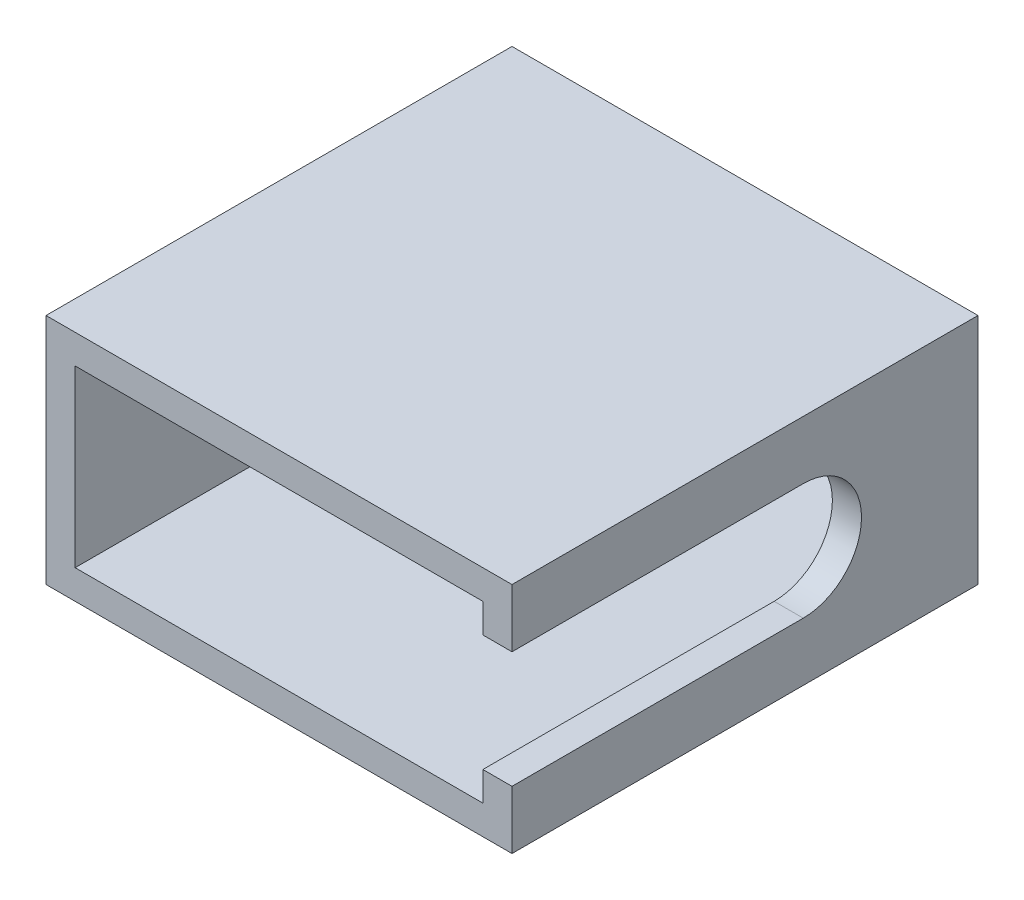
ISO-10303-21;
HEADER;
FILE_DESCRIPTION(('STEP AP214'),'2;1');
FILE_NAME('part.step','',(''),(''),'','','');
FILE_SCHEMA(('AUTOMOTIVE_DESIGN { 1 0 10303 214 1 1 1 1 }'));
ENDSEC;
DATA;
#1=APPLICATION_CONTEXT('core data for automotive mechanical design processes');
#2=APPLICATION_PROTOCOL_DEFINITION('international standard','automotive_design',2000,#1);
#3=PRODUCT_CONTEXT('',#1,'mechanical');
#4=PRODUCT('Part','Part','',(#3));
#5=PRODUCT_RELATED_PRODUCT_CATEGORY('part','',(#4));
#6=PRODUCT_DEFINITION_FORMATION('','',#4);
#7=PRODUCT_DEFINITION_CONTEXT('part definition',#1,'design');
#8=PRODUCT_DEFINITION('design','',#6,#7);
#9=PRODUCT_DEFINITION_SHAPE('','',#8);
#10=(LENGTH_UNIT() NAMED_UNIT(*) SI_UNIT(.MILLI.,.METRE.));
#11=(NAMED_UNIT(*) PLANE_ANGLE_UNIT() SI_UNIT($,.RADIAN.));
#12=(NAMED_UNIT(*) SI_UNIT($,.STERADIAN.) SOLID_ANGLE_UNIT());
#13=UNCERTAINTY_MEASURE_WITH_UNIT(LENGTH_MEASURE(1.E-05),#10,'distance_accuracy_value','');
#14=(GEOMETRIC_REPRESENTATION_CONTEXT(3) GLOBAL_UNCERTAINTY_ASSIGNED_CONTEXT((#13)) GLOBAL_UNIT_ASSIGNED_CONTEXT((#10,
#11,#12)) REPRESENTATION_CONTEXT('',''));
#15=CARTESIAN_POINT('',(0.,0.,0.));
#16=DIRECTION('',(0.,0.,1.));
#17=DIRECTION('',(1.,0.,0.));
#18=AXIS2_PLACEMENT_3D('',#15,#16,#17);
#19=CARTESIAN_POINT('',(25.4,12.7,50.8));
#20=DIRECTION('',(-1.,0.,0.));
#21=DIRECTION('',(0.,-1.,0.));
#22=AXIS2_PLACEMENT_3D('',#19,#20,#21);
#23=PLANE('',#22);
#24=DIRECTION('',(0.,1.,0.));
#25=VECTOR('',#24,1.);
#26=CARTESIAN_POINT('',(25.4,12.7,50.8));
#27=LINE('',#26,#25);
#28=CARTESIAN_POINT('',(25.4,6.35,50.8));
#29=VERTEX_POINT('',#28);
#30=CARTESIAN_POINT('',(25.4,12.7,50.8));
#31=VERTEX_POINT('',#30);
#32=EDGE_CURVE('E121',#29,#31,#27,.T.);
#33=ORIENTED_EDGE('',*,*,#32,.F.);
#34=DIRECTION('',(0.,0.,1.));
#35=VECTOR('',#34,1.);
#36=CARTESIAN_POINT('',(25.4,6.35,50.8));
#37=LINE('',#36,#35);
#38=CARTESIAN_POINT('',(25.4,6.35,19.05));
#39=VERTEX_POINT('',#38);
#40=EDGE_CURVE('E104',#39,#29,#37,.T.);
#41=ORIENTED_EDGE('',*,*,#40,.F.);
#42=CARTESIAN_POINT('',(25.4,0.,19.05));
#43=DIRECTION('',(1.,0.,0.));
#44=DIRECTION('',(0.,1.,0.));
#45=AXIS2_PLACEMENT_3D('',#42,#43,#44);
#46=CIRCLE('',#45,6.35);
#47=CARTESIAN_POINT('',(25.4,-6.35,19.05));
#48=VERTEX_POINT('',#47);
#49=EDGE_CURVE('E116',#48,#39,#46,.T.);
#50=ORIENTED_EDGE('',*,*,#49,.F.);
#51=DIRECTION('',(0.,0.,-1.));
#52=VECTOR('',#51,1.);
#53=CARTESIAN_POINT('',(25.4,-6.35,50.8));
#54=LINE('',#53,#52);
#55=CARTESIAN_POINT('',(25.4,-6.35,50.8));
#56=VERTEX_POINT('',#55);
#57=EDGE_CURVE('E175',#56,#48,#54,.T.);
#58=ORIENTED_EDGE('',*,*,#57,.F.);
#59=CARTESIAN_POINT('',(25.4,-12.7,50.8));
#60=VERTEX_POINT('',#59);
#61=EDGE_CURVE('E130',#60,#56,#27,.T.);
#62=ORIENTED_EDGE('',*,*,#61,.F.);
#63=DIRECTION('',(0.,0.,-1.));
#64=VECTOR('',#63,1.);
#65=CARTESIAN_POINT('',(25.4,-12.7,50.8));
#66=LINE('',#65,#64);
#67=CARTESIAN_POINT('',(25.4,-12.7,0.));
#68=VERTEX_POINT('',#67);
#69=EDGE_CURVE('E146',#60,#68,#66,.T.);
#70=ORIENTED_EDGE('',*,*,#69,.T.);
#71=DIRECTION('',(0.,1.,0.));
#72=VECTOR('',#71,1.);
#73=CARTESIAN_POINT('',(25.4,12.7,0.));
#74=LINE('',#73,#72);
#75=CARTESIAN_POINT('',(25.4,12.7,0.));
#76=VERTEX_POINT('',#75);
#77=EDGE_CURVE('E147',#68,#76,#74,.T.);
#78=ORIENTED_EDGE('',*,*,#77,.T.);
#79=DIRECTION('',(0.,0.,-1.));
#80=VECTOR('',#79,1.);
#81=CARTESIAN_POINT('',(25.4,12.7,50.8));
#82=LINE('',#81,#80);
#83=EDGE_CURVE('E11',#31,#76,#82,.T.);
#84=ORIENTED_EDGE('',*,*,#83,.F.);
#85=EDGE_LOOP('',(#33,#41,#50,#58,#62,#70,#78,#84));
#86=FACE_BOUND('',#85,.T.);
#87=ADVANCED_FACE('F17',(#86),#23,.F.);
#88=CARTESIAN_POINT('',(-25.4,12.7,50.8));
#89=DIRECTION('',(0.,-1.,0.));
#90=DIRECTION('',(0.,0.,-1.));
#91=AXIS2_PLACEMENT_3D('',#88,#89,#90);
#92=PLANE('',#91);
#93=DIRECTION('',(-1.,0.,0.));
#94=VECTOR('',#93,1.);
#95=CARTESIAN_POINT('',(-25.4,12.7,0.));
#96=LINE('',#95,#94);
#97=CARTESIAN_POINT('',(-25.4,12.7,0.));
#98=VERTEX_POINT('',#97);
#99=EDGE_CURVE('E149',#76,#98,#96,.T.);
#100=ORIENTED_EDGE('',*,*,#99,.T.);
#101=DIRECTION('',(0.,0.,-1.));
#102=VECTOR('',#101,1.);
#103=CARTESIAN_POINT('',(-25.4,12.7,50.8));
#104=LINE('',#103,#102);
#105=CARTESIAN_POINT('',(-25.4,12.7,50.8));
#106=VERTEX_POINT('',#105);
#107=EDGE_CURVE('E24',#106,#98,#104,.T.);
#108=ORIENTED_EDGE('',*,*,#107,.F.);
#109=DIRECTION('',(-1.,0.,0.));
#110=VECTOR('',#109,1.);
#111=CARTESIAN_POINT('',(-25.4,12.7,50.8));
#112=LINE('',#111,#110);
#113=EDGE_CURVE('E134',#31,#106,#112,.T.);
#114=ORIENTED_EDGE('',*,*,#113,.F.);
#115=ORIENTED_EDGE('',*,*,#83,.T.);
#116=EDGE_LOOP('',(#100,#108,#114,#115));
#117=FACE_BOUND('',#116,.T.);
#118=ADVANCED_FACE('F180',(#117),#92,.F.);
#119=CARTESIAN_POINT('',(-25.4,12.7,50.8));
#120=DIRECTION('',(1.,0.,0.));
#121=DIRECTION('',(0.,1.,0.));
#122=AXIS2_PLACEMENT_3D('',#119,#120,#121);
#123=PLANE('',#122);
#124=DIRECTION('',(0.,-1.,0.));
#125=VECTOR('',#124,1.);
#126=CARTESIAN_POINT('',(-25.4,12.7,0.));
#127=LINE('',#126,#125);
#128=CARTESIAN_POINT('',(-25.4,-12.7,0.));
#129=VERTEX_POINT('',#128);
#130=EDGE_CURVE('E135',#98,#129,#127,.T.);
#131=ORIENTED_EDGE('',*,*,#130,.T.);
#132=DIRECTION('',(0.,0.,-1.));
#133=VECTOR('',#132,1.);
#134=CARTESIAN_POINT('',(-25.4,-12.7,50.8));
#135=LINE('',#134,#133);
#136=CARTESIAN_POINT('',(-25.4,-12.7,50.8));
#137=VERTEX_POINT('',#136);
#138=EDGE_CURVE('E155',#137,#129,#135,.T.);
#139=ORIENTED_EDGE('',*,*,#138,.F.);
#140=DIRECTION('',(0.,-1.,0.));
#141=VECTOR('',#140,1.);
#142=CARTESIAN_POINT('',(-25.4,12.7,50.8));
#143=LINE('',#142,#141);
#144=EDGE_CURVE('E142',#106,#137,#143,.T.);
#145=ORIENTED_EDGE('',*,*,#144,.F.);
#146=ORIENTED_EDGE('',*,*,#107,.T.);
#147=EDGE_LOOP('',(#131,#139,#145,#146));
#148=FACE_BOUND('',#147,.T.);
#149=ADVANCED_FACE('F162',(#148),#123,.F.);
#150=CARTESIAN_POINT('',(-25.4,-12.7,50.8));
#151=DIRECTION('',(0.,1.,0.));
#152=DIRECTION('',(0.,0.,1.));
#153=AXIS2_PLACEMENT_3D('',#150,#151,#152);
#154=PLANE('',#153);
#155=DIRECTION('',(1.,0.,0.));
#156=VECTOR('',#155,1.);
#157=CARTESIAN_POINT('',(-25.4,-12.7,0.));
#158=LINE('',#157,#156);
#159=EDGE_CURVE('E131',#129,#68,#158,.T.);
#160=ORIENTED_EDGE('',*,*,#159,.T.);
#161=ORIENTED_EDGE('',*,*,#69,.F.);
#162=DIRECTION('',(1.,0.,0.));
#163=VECTOR('',#162,1.);
#164=CARTESIAN_POINT('',(-25.4,-12.7,50.8));
#165=LINE('',#164,#163);
#166=EDGE_CURVE('E144',#137,#60,#165,.T.);
#167=ORIENTED_EDGE('',*,*,#166,.F.);
#168=ORIENTED_EDGE('',*,*,#138,.T.);
#169=EDGE_LOOP('',(#160,#161,#167,#168));
#170=FACE_BOUND('',#169,.T.);
#171=ADVANCED_FACE('F171',(#170),#154,.F.);
#172=CARTESIAN_POINT('',(25.4,-12.7,50.8));
#173=DIRECTION('',(0.,0.,1.));
#174=DIRECTION('',(1.,0.,0.));
#175=AXIS2_PLACEMENT_3D('',#172,#173,#174);
#176=PLANE('',#175);
#177=DIRECTION('',(1.,0.,0.));
#178=VECTOR('',#177,1.);
#179=CARTESIAN_POINT('',(-25.401,6.35,50.8));
#180=LINE('',#179,#178);
#181=CARTESIAN_POINT('',(22.225,6.35,50.8));
#182=VERTEX_POINT('',#181);
#183=EDGE_CURVE('E107',#182,#29,#180,.T.);
#184=ORIENTED_EDGE('',*,*,#183,.T.);
#185=ORIENTED_EDGE('',*,*,#32,.T.);
#186=ORIENTED_EDGE('',*,*,#113,.T.);
#187=ORIENTED_EDGE('',*,*,#144,.T.);
#188=ORIENTED_EDGE('',*,*,#166,.T.);
#189=ORIENTED_EDGE('',*,*,#61,.T.);
#190=DIRECTION('',(1.,0.,0.));
#191=VECTOR('',#190,1.);
#192=CARTESIAN_POINT('',(-25.401,-6.35,50.8));
#193=LINE('',#192,#191);
#194=CARTESIAN_POINT('',(22.225,-6.35,50.8));
#195=VERTEX_POINT('',#194);
#196=EDGE_CURVE('E178',#195,#56,#193,.T.);
#197=ORIENTED_EDGE('',*,*,#196,.F.);
#198=DIRECTION('',(0.,1.,0.));
#199=VECTOR('',#198,1.);
#200=CARTESIAN_POINT('',(22.225,12.7,50.8));
#201=LINE('',#200,#199);
#202=CARTESIAN_POINT('',(22.225,-9.525,50.8));
#203=VERTEX_POINT('',#202);
#204=EDGE_CURVE('E249',#203,#195,#201,.T.);
#205=ORIENTED_EDGE('',*,*,#204,.F.);
#206=DIRECTION('',(1.,0.,0.));
#207=VECTOR('',#206,1.);
#208=CARTESIAN_POINT('',(-25.4,-9.525,50.8));
#209=LINE('',#208,#207);
#210=CARTESIAN_POINT('',(-22.225,-9.525,50.8));
#211=VERTEX_POINT('',#210);
#212=EDGE_CURVE('E139',#211,#203,#209,.T.);
#213=ORIENTED_EDGE('',*,*,#212,.F.);
#214=DIRECTION('',(0.,-1.,0.));
#215=VECTOR('',#214,1.);
#216=CARTESIAN_POINT('',(-22.225,12.7,50.8));
#217=LINE('',#216,#215);
#218=CARTESIAN_POINT('',(-22.225,9.525,50.8));
#219=VERTEX_POINT('',#218);
#220=EDGE_CURVE('E252',#219,#211,#217,.T.);
#221=ORIENTED_EDGE('',*,*,#220,.F.);
#222=DIRECTION('',(-1.,0.,0.));
#223=VECTOR('',#222,1.);
#224=CARTESIAN_POINT('',(-25.4,9.525,50.8));
#225=LINE('',#224,#223);
#226=CARTESIAN_POINT('',(22.225,9.525,50.8));
#227=VERTEX_POINT('',#226);
#228=EDGE_CURVE('E251',#227,#219,#225,.T.);
#229=ORIENTED_EDGE('',*,*,#228,.F.);
#230=EDGE_CURVE('E124',#182,#227,#201,.T.);
#231=ORIENTED_EDGE('',*,*,#230,.F.);
#232=EDGE_LOOP('',(#184,#185,#186,#187,#188,#189,#197,#205,#213,#221,#229,#231));
#233=FACE_BOUND('',#232,.T.);
#234=ADVANCED_FACE('F120',(#233),#176,.T.);
#235=CARTESIAN_POINT('',(25.4,-12.7,0.));
#236=DIRECTION('',(0.,0.,1.));
#237=DIRECTION('',(1.,0.,0.));
#238=AXIS2_PLACEMENT_3D('',#235,#236,#237);
#239=PLANE('',#238);
#240=DIRECTION('',(1.,0.,0.));
#241=VECTOR('',#240,1.);
#242=CARTESIAN_POINT('',(-25.4,-9.525,0.));
#243=LINE('',#242,#241);
#244=CARTESIAN_POINT('',(-22.225,-9.525,0.));
#245=VERTEX_POINT('',#244);
#246=CARTESIAN_POINT('',(22.225,-9.525,0.));
#247=VERTEX_POINT('',#246);
#248=EDGE_CURVE('E241',#245,#247,#243,.T.);
#249=ORIENTED_EDGE('',*,*,#248,.T.);
#250=DIRECTION('',(0.,1.,0.));
#251=VECTOR('',#250,1.);
#252=CARTESIAN_POINT('',(22.225,12.7,0.));
#253=LINE('',#252,#251);
#254=CARTESIAN_POINT('',(22.225,9.525,0.));
#255=VERTEX_POINT('',#254);
#256=EDGE_CURVE('E115',#247,#255,#253,.T.);
#257=ORIENTED_EDGE('',*,*,#256,.T.);
#258=DIRECTION('',(-1.,0.,0.));
#259=VECTOR('',#258,1.);
#260=CARTESIAN_POINT('',(-25.4,9.525,0.));
#261=LINE('',#260,#259);
#262=CARTESIAN_POINT('',(-22.225,9.525,0.));
#263=VERTEX_POINT('',#262);
#264=EDGE_CURVE('E240',#255,#263,#261,.T.);
#265=ORIENTED_EDGE('',*,*,#264,.T.);
#266=DIRECTION('',(0.,-1.,0.));
#267=VECTOR('',#266,1.);
#268=CARTESIAN_POINT('',(-22.225,12.7,0.));
#269=LINE('',#268,#267);
#270=EDGE_CURVE('E244',#263,#245,#269,.T.);
#271=ORIENTED_EDGE('',*,*,#270,.T.);
#272=EDGE_LOOP('',(#249,#257,#265,#271));
#273=FACE_BOUND('',#272,.T.);
#274=ORIENTED_EDGE('',*,*,#77,.F.);
#275=ORIENTED_EDGE('',*,*,#159,.F.);
#276=ORIENTED_EDGE('',*,*,#130,.F.);
#277=ORIENTED_EDGE('',*,*,#99,.F.);
#278=EDGE_LOOP('',(#274,#275,#276,#277));
#279=FACE_BOUND('',#278,.T.);
#280=ADVANCED_FACE('F168',(#273,#279),#239,.F.);
#281=CARTESIAN_POINT('',(22.225,12.7,50.8));
#282=DIRECTION('',(-1.,0.,0.));
#283=DIRECTION('',(0.,-1.,0.));
#284=AXIS2_PLACEMENT_3D('',#281,#282,#283);
#285=PLANE('',#284);
#286=DIRECTION('',(0.,0.,1.));
#287=VECTOR('',#286,1.);
#288=CARTESIAN_POINT('',(22.225,6.35,50.8));
#289=LINE('',#288,#287);
#290=CARTESIAN_POINT('',(22.225,6.35,19.05));
#291=VERTEX_POINT('',#290);
#292=EDGE_CURVE('E126',#291,#182,#289,.T.);
#293=ORIENTED_EDGE('',*,*,#292,.T.);
#294=ORIENTED_EDGE('',*,*,#230,.T.);
#295=DIRECTION('',(0.,0.,-1.));
#296=VECTOR('',#295,1.);
#297=CARTESIAN_POINT('',(22.225,9.525,50.8));
#298=LINE('',#297,#296);
#299=EDGE_CURVE('E150',#227,#255,#298,.T.);
#300=ORIENTED_EDGE('',*,*,#299,.T.);
#301=ORIENTED_EDGE('',*,*,#256,.F.);
#302=DIRECTION('',(0.,0.,-1.));
#303=VECTOR('',#302,1.);
#304=CARTESIAN_POINT('',(22.225,-9.525,50.8));
#305=LINE('',#304,#303);
#306=EDGE_CURVE('E233',#203,#247,#305,.T.);
#307=ORIENTED_EDGE('',*,*,#306,.F.);
#308=ORIENTED_EDGE('',*,*,#204,.T.);
#309=DIRECTION('',(0.,0.,-1.));
#310=VECTOR('',#309,1.);
#311=CARTESIAN_POINT('',(22.225,-6.35,50.8));
#312=LINE('',#311,#310);
#313=CARTESIAN_POINT('',(22.225,-6.35,19.05));
#314=VERTEX_POINT('',#313);
#315=EDGE_CURVE('E224',#195,#314,#312,.T.);
#316=ORIENTED_EDGE('',*,*,#315,.T.);
#317=CARTESIAN_POINT('',(22.225,0.,19.05));
#318=DIRECTION('',(-1.,0.,0.));
#319=DIRECTION('',(0.,-1.,0.));
#320=AXIS2_PLACEMENT_3D('',#317,#318,#319);
#321=CIRCLE('',#320,6.35);
#322=EDGE_CURVE('E125',#314,#291,#321,.F.);
#323=ORIENTED_EDGE('',*,*,#322,.T.);
#324=EDGE_LOOP('',(#293,#294,#300,#301,#307,#308,#316,#323));
#325=FACE_BOUND('',#324,.T.);
#326=ADVANCED_FACE('F194',(#325),#285,.T.);
#327=CARTESIAN_POINT('',(-25.4,9.525,50.8));
#328=DIRECTION('',(0.,-1.,0.));
#329=DIRECTION('',(0.,0.,-1.));
#330=AXIS2_PLACEMENT_3D('',#327,#328,#329);
#331=PLANE('',#330);
#332=ORIENTED_EDGE('',*,*,#264,.F.);
#333=ORIENTED_EDGE('',*,*,#299,.F.);
#334=ORIENTED_EDGE('',*,*,#228,.T.);
#335=DIRECTION('',(0.,0.,-1.));
#336=VECTOR('',#335,1.);
#337=CARTESIAN_POINT('',(-22.225,9.525,50.8));
#338=LINE('',#337,#336);
#339=EDGE_CURVE('E232',#219,#263,#338,.T.);
#340=ORIENTED_EDGE('',*,*,#339,.T.);
#341=EDGE_LOOP('',(#332,#333,#334,#340));
#342=FACE_BOUND('',#341,.T.);
#343=ADVANCED_FACE('F204',(#342),#331,.T.);
#344=CARTESIAN_POINT('',(-22.225,12.7,50.8));
#345=DIRECTION('',(1.,0.,0.));
#346=DIRECTION('',(0.,1.,0.));
#347=AXIS2_PLACEMENT_3D('',#344,#345,#346);
#348=PLANE('',#347);
#349=ORIENTED_EDGE('',*,*,#270,.F.);
#350=ORIENTED_EDGE('',*,*,#339,.F.);
#351=ORIENTED_EDGE('',*,*,#220,.T.);
#352=DIRECTION('',(0.,0.,-1.));
#353=VECTOR('',#352,1.);
#354=CARTESIAN_POINT('',(-22.225,-9.525,50.8));
#355=LINE('',#354,#353);
#356=EDGE_CURVE('E39',#211,#245,#355,.T.);
#357=ORIENTED_EDGE('',*,*,#356,.T.);
#358=EDGE_LOOP('',(#349,#350,#351,#357));
#359=FACE_BOUND('',#358,.T.);
#360=ADVANCED_FACE('F201',(#359),#348,.T.);
#361=CARTESIAN_POINT('',(-25.4,-9.525,50.8));
#362=DIRECTION('',(0.,1.,0.));
#363=DIRECTION('',(0.,0.,1.));
#364=AXIS2_PLACEMENT_3D('',#361,#362,#363);
#365=PLANE('',#364);
#366=ORIENTED_EDGE('',*,*,#248,.F.);
#367=ORIENTED_EDGE('',*,*,#356,.F.);
#368=ORIENTED_EDGE('',*,*,#212,.T.);
#369=ORIENTED_EDGE('',*,*,#306,.T.);
#370=EDGE_LOOP('',(#366,#367,#368,#369));
#371=FACE_BOUND('',#370,.T.);
#372=ADVANCED_FACE('F198',(#371),#365,.T.);
#373=CARTESIAN_POINT('',(-25.401,6.35,50.8));
#374=DIRECTION('',(0.,1.,0.));
#375=DIRECTION('',(-1.,0.,0.));
#376=AXIS2_PLACEMENT_3D('',#373,#374,#375);
#377=PLANE('',#376);
#378=DIRECTION('',(1.,0.,0.));
#379=VECTOR('',#378,1.);
#380=CARTESIAN_POINT('',(-25.401,6.35,19.05));
#381=LINE('',#380,#379);
#382=EDGE_CURVE('E110',#291,#39,#381,.T.);
#383=ORIENTED_EDGE('',*,*,#382,.T.);
#384=ORIENTED_EDGE('',*,*,#40,.T.);
#385=ORIENTED_EDGE('',*,*,#183,.F.);
#386=ORIENTED_EDGE('',*,*,#292,.F.);
#387=EDGE_LOOP('',(#383,#384,#385,#386));
#388=FACE_BOUND('',#387,.T.);
#389=ADVANCED_FACE('F106',(#388),#377,.F.);
#390=CARTESIAN_POINT('',(-25.401,0.,19.05));
#391=DIRECTION('',(1.,0.,0.));
#392=DIRECTION('',(0.,1.,0.));
#393=AXIS2_PLACEMENT_3D('',#390,#391,#392);
#394=CYLINDRICAL_SURFACE('',#393,6.35);
#395=DIRECTION('',(1.,0.,0.));
#396=VECTOR('',#395,1.);
#397=CARTESIAN_POINT('',(-25.401,-6.35,19.05));
#398=LINE('',#397,#396);
#399=EDGE_CURVE('E31',#314,#48,#398,.T.);
#400=ORIENTED_EDGE('',*,*,#399,.T.);
#401=ORIENTED_EDGE('',*,*,#49,.T.);
#402=ORIENTED_EDGE('',*,*,#382,.F.);
#403=ORIENTED_EDGE('',*,*,#322,.F.);
#404=EDGE_LOOP('',(#400,#401,#402,#403));
#405=FACE_BOUND('',#404,.T.);
#406=ADVANCED_FACE('F214',(#405),#394,.F.);
#407=CARTESIAN_POINT('',(-25.401,-6.35,50.8));
#408=DIRECTION('',(0.,-1.,0.));
#409=DIRECTION('',(1.,0.,0.));
#410=AXIS2_PLACEMENT_3D('',#407,#408,#409);
#411=PLANE('',#410);
#412=ORIENTED_EDGE('',*,*,#196,.T.);
#413=ORIENTED_EDGE('',*,*,#57,.T.);
#414=ORIENTED_EDGE('',*,*,#399,.F.);
#415=ORIENTED_EDGE('',*,*,#315,.F.);
#416=EDGE_LOOP('',(#412,#413,#414,#415));
#417=FACE_BOUND('',#416,.T.);
#418=ADVANCED_FACE('F217',(#417),#411,.F.);
#419=CLOSED_SHELL('',(#87,#118,#149,#171,#234,#280,#326,#343,#360,#372,#389,#406,#418));
#420=MANIFOLD_SOLID_BREP('B1',#419);
#421=ADVANCED_BREP_SHAPE_REPRESENTATION('',(#18,#420),#14);
#422=SHAPE_DEFINITION_REPRESENTATION(#9,#421);
ENDSEC;
END-ISO-10303-21;
